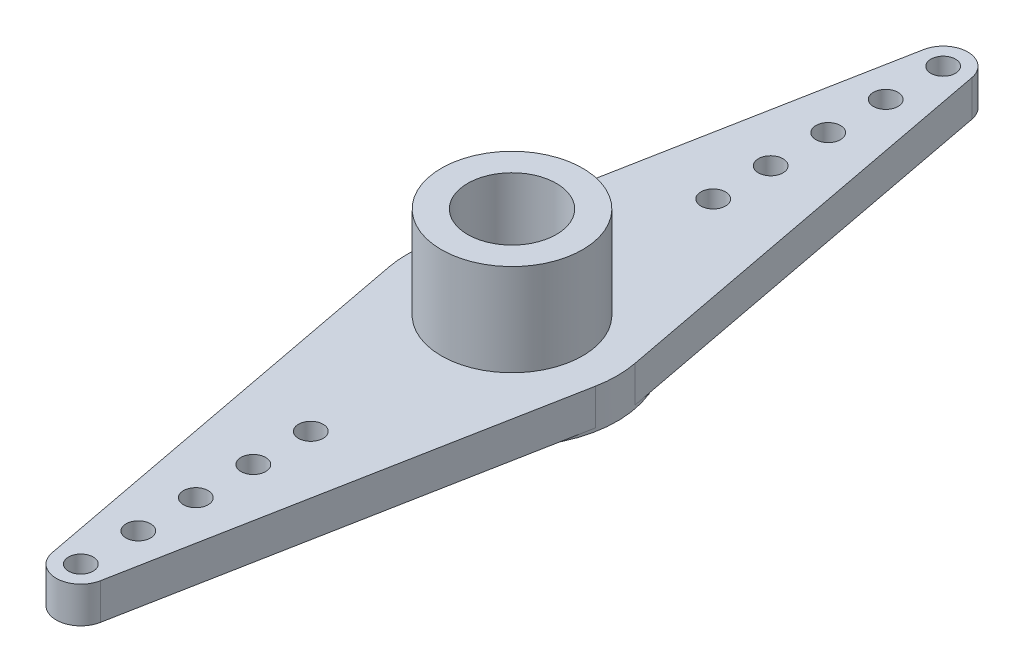
ISO-10303-21;
HEADER;
FILE_DESCRIPTION(('STEP AP214'),'2;1');
FILE_NAME('part.step','',(''),(''),'','','');
FILE_SCHEMA(('AUTOMOTIVE_DESIGN { 1 0 10303 214 1 1 1 1 }'));
ENDSEC;
DATA;
#1=APPLICATION_CONTEXT('core data for automotive mechanical design processes');
#2=APPLICATION_PROTOCOL_DEFINITION('international standard','automotive_design',2000,#1);
#3=PRODUCT_CONTEXT('',#1,'mechanical');
#4=PRODUCT('Part','Part','',(#3));
#5=PRODUCT_RELATED_PRODUCT_CATEGORY('part','',(#4));
#6=PRODUCT_DEFINITION_FORMATION('','',#4);
#7=PRODUCT_DEFINITION_CONTEXT('part definition',#1,'design');
#8=PRODUCT_DEFINITION('design','',#6,#7);
#9=PRODUCT_DEFINITION_SHAPE('','',#8);
#10=(LENGTH_UNIT() NAMED_UNIT(*) SI_UNIT(.MILLI.,.METRE.));
#11=(NAMED_UNIT(*) PLANE_ANGLE_UNIT() SI_UNIT($,.RADIAN.));
#12=(NAMED_UNIT(*) SI_UNIT($,.STERADIAN.) SOLID_ANGLE_UNIT());
#13=UNCERTAINTY_MEASURE_WITH_UNIT(LENGTH_MEASURE(1.E-05),#10,'distance_accuracy_value','');
#14=(GEOMETRIC_REPRESENTATION_CONTEXT(3) GLOBAL_UNCERTAINTY_ASSIGNED_CONTEXT((#13)) GLOBAL_UNIT_ASSIGNED_CONTEXT((#10,
#11,#12)) REPRESENTATION_CONTEXT('',''));
#15=CARTESIAN_POINT('',(0.,0.,0.));
#16=DIRECTION('',(0.,0.,1.));
#17=DIRECTION('',(1.,0.,0.));
#18=AXIS2_PLACEMENT_3D('',#15,#16,#17);
#19=CARTESIAN_POINT('',(0.,2.2,0.));
#20=DIRECTION('',(0.,-1.,0.));
#21=DIRECTION('',(0.,0.,-1.));
#22=AXIS2_PLACEMENT_3D('',#19,#20,#21);
#23=CYLINDRICAL_SURFACE('',#22,1.5);
#24=CARTESIAN_POINT('',(0.,2.2,0.));
#25=DIRECTION('',(0.,1.,0.));
#26=DIRECTION('',(0.,0.,1.));
#27=AXIS2_PLACEMENT_3D('',#24,#25,#26);
#28=CIRCLE('',#27,1.5);
#29=CARTESIAN_POINT('',(0.,2.2,1.5));
#30=VERTEX_POINT('',#29);
#31=EDGE_CURVE('E142',#30,#30,#28,.T.);
#32=ORIENTED_EDGE('',*,*,#31,.T.);
#33=EDGE_LOOP('',(#32));
#34=FACE_BOUND('',#33,.T.);
#35=CARTESIAN_POINT('',(0.,1.5,0.));
#36=DIRECTION('',(0.,-1.,0.));
#37=DIRECTION('',(0.,0.,-1.));
#38=AXIS2_PLACEMENT_3D('',#35,#36,#37);
#39=CIRCLE('',#38,1.5);
#40=CARTESIAN_POINT('',(0.,1.5,-1.5));
#41=VERTEX_POINT('',#40);
#42=EDGE_CURVE('E43',#41,#41,#39,.T.);
#43=ORIENTED_EDGE('',*,*,#42,.T.);
#44=EDGE_LOOP('',(#43));
#45=FACE_BOUND('',#44,.T.);
#46=ADVANCED_FACE('F39',(#34,#45),#23,.F.);
#47=CARTESIAN_POINT('',(0.,0.,26.25));
#48=DIRECTION('',(0.,1.,0.));
#49=DIRECTION('',(0.,0.,1.));
#50=AXIS2_PLACEMENT_3D('',#47,#48,#49);
#51=PLANE('',#50);
#52=CARTESIAN_POINT('',(0.,0.,26.25));
#53=DIRECTION('',(0.,-1.,0.));
#54=DIRECTION('',(0.,0.,-1.));
#55=AXIS2_PLACEMENT_3D('',#52,#53,#54);
#56=CIRCLE('',#55,0.75);
#57=CARTESIAN_POINT('',(0.,0.,25.5));
#58=VERTEX_POINT('',#57);
#59=EDGE_CURVE('E270',#58,#58,#56,.T.);
#60=ORIENTED_EDGE('',*,*,#59,.F.);
#61=EDGE_LOOP('',(#60));
#62=FACE_BOUND('',#61,.T.);
#63=CARTESIAN_POINT('',(0.,0.,22.75));
#64=DIRECTION('',(0.,-1.,0.));
#65=DIRECTION('',(0.,0.,-1.));
#66=AXIS2_PLACEMENT_3D('',#63,#64,#65);
#67=CIRCLE('',#66,0.75);
#68=CARTESIAN_POINT('',(0.,0.,22.));
#69=VERTEX_POINT('',#68);
#70=EDGE_CURVE('E280',#69,#69,#67,.T.);
#71=ORIENTED_EDGE('',*,*,#70,.F.);
#72=EDGE_LOOP('',(#71));
#73=FACE_BOUND('',#72,.T.);
#74=CARTESIAN_POINT('',(0.,0.,19.25));
#75=DIRECTION('',(0.,-1.,0.));
#76=DIRECTION('',(0.,0.,-1.));
#77=AXIS2_PLACEMENT_3D('',#74,#75,#76);
#78=CIRCLE('',#77,0.75);
#79=CARTESIAN_POINT('',(0.,0.,18.5));
#80=VERTEX_POINT('',#79);
#81=EDGE_CURVE('E286',#80,#80,#78,.T.);
#82=ORIENTED_EDGE('',*,*,#81,.F.);
#83=EDGE_LOOP('',(#82));
#84=FACE_BOUND('',#83,.T.);
#85=CARTESIAN_POINT('',(0.,0.,15.75));
#86=DIRECTION('',(0.,-1.,0.));
#87=DIRECTION('',(0.,0.,-1.));
#88=AXIS2_PLACEMENT_3D('',#85,#86,#87);
#89=CIRCLE('',#88,0.75);
#90=CARTESIAN_POINT('',(0.,0.,15.));
#91=VERTEX_POINT('',#90);
#92=EDGE_CURVE('E292',#91,#91,#89,.T.);
#93=ORIENTED_EDGE('',*,*,#92,.F.);
#94=EDGE_LOOP('',(#93));
#95=FACE_BOUND('',#94,.T.);
#96=CARTESIAN_POINT('',(0.,0.,12.25));
#97=DIRECTION('',(0.,-1.,0.));
#98=DIRECTION('',(0.,0.,-1.));
#99=AXIS2_PLACEMENT_3D('',#96,#97,#98);
#100=CIRCLE('',#99,0.75);
#101=CARTESIAN_POINT('',(0.,0.,11.5));
#102=VERTEX_POINT('',#101);
#103=EDGE_CURVE('E296',#102,#102,#100,.T.);
#104=ORIENTED_EDGE('',*,*,#103,.F.);
#105=EDGE_LOOP('',(#104));
#106=FACE_BOUND('',#105,.T.);
#107=CARTESIAN_POINT('',(0.,0.,0.));
#108=DIRECTION('',(0.,-1.,0.));
#109=DIRECTION('',(0.,0.,-1.));
#110=AXIS2_PLACEMENT_3D('',#107,#108,#109);
#111=CIRCLE('',#110,6.4);
#112=CARTESIAN_POINT('',(6.28750916942119,0.,1.19466666666667));
#113=VERTEX_POINT('',#112);
#114=CARTESIAN_POINT('',(-6.28750916942119,0.,1.19466666666666));
#115=VERTEX_POINT('',#114);
#116=EDGE_CURVE('E11',#113,#115,#111,.T.);
#117=ORIENTED_EDGE('',*,*,#116,.F.);
#118=DIRECTION('',(0.186666666666667,0.,-0.982423307722061));
#119=VECTOR('',#118,1.);
#120=CARTESIAN_POINT('',(1.47363496158309,0.,26.53));
#121=LINE('',#120,#119);
#122=CARTESIAN_POINT('',(1.47363496158309,0.,26.53));
#123=VERTEX_POINT('',#122);
#124=EDGE_CURVE('E141',#123,#113,#121,.T.);
#125=ORIENTED_EDGE('',*,*,#124,.F.);
#126=CARTESIAN_POINT('',(0.,0.,26.25));
#127=DIRECTION('',(0.,1.,0.));
#128=DIRECTION('',(0.,0.,1.));
#129=AXIS2_PLACEMENT_3D('',#126,#127,#128);
#130=CIRCLE('',#129,1.5);
#131=CARTESIAN_POINT('',(-1.47363496158309,0.,26.53));
#132=VERTEX_POINT('',#131);
#133=EDGE_CURVE('E138',#132,#123,#130,.T.);
#134=ORIENTED_EDGE('',*,*,#133,.F.);
#135=DIRECTION('',(0.186666666666667,0.,0.982423307722061));
#136=VECTOR('',#135,1.);
#137=CARTESIAN_POINT('',(-1.47363496158309,0.,26.53));
#138=LINE('',#137,#136);
#139=EDGE_CURVE('E87',#115,#132,#138,.T.);
#140=ORIENTED_EDGE('',*,*,#139,.F.);
#141=EDGE_LOOP('',(#117,#125,#134,#140));
#142=FACE_BOUND('',#141,.T.);
#143=ADVANCED_FACE('F205',(#62,#73,#84,#95,#106,#142),#51,.F.);
#144=CARTESIAN_POINT('',(0.,2.2,26.25));
#145=DIRECTION('',(0.,1.,0.));
#146=DIRECTION('',(0.,0.,1.));
#147=AXIS2_PLACEMENT_3D('',#144,#145,#146);
#148=PLANE('',#147);
#149=ORIENTED_EDGE('',*,*,#31,.F.);
#150=EDGE_LOOP('',(#149));
#151=FACE_BOUND('',#150,.T.);
#152=CARTESIAN_POINT('',(0.,2.2,0.));
#153=DIRECTION('',(0.,1.,0.));
#154=DIRECTION('',(0.,0.,1.));
#155=AXIS2_PLACEMENT_3D('',#152,#153,#154);
#156=CIRCLE('',#155,2.7);
#157=CARTESIAN_POINT('',(0.,2.2,2.7));
#158=VERTEX_POINT('',#157);
#159=EDGE_CURVE('E165',#158,#158,#156,.F.);
#160=ORIENTED_EDGE('',*,*,#159,.F.);
#161=EDGE_LOOP('',(#160));
#162=FACE_BOUND('',#161,.T.);
#163=ADVANCED_FACE('F229',(#151,#162),#148,.T.);
#164=CARTESIAN_POINT('',(0.,2.2,-12.25));
#165=DIRECTION('',(0.,1.,0.));
#166=DIRECTION('',(0.,0.,1.));
#167=AXIS2_PLACEMENT_3D('',#164,#165,#166);
#168=CIRCLE('',#167,0.75);
#169=CARTESIAN_POINT('',(0.,2.2,-11.5));
#170=VERTEX_POINT('',#169);
#171=EDGE_CURVE('E277',#170,#170,#168,.T.);
#172=ORIENTED_EDGE('',*,*,#171,.F.);
#173=EDGE_LOOP('',(#172));
#174=FACE_BOUND('',#173,.T.);
#175=CARTESIAN_POINT('',(0.,2.2,-15.75));
#176=DIRECTION('',(0.,1.,0.));
#177=DIRECTION('',(0.,0.,1.));
#178=AXIS2_PLACEMENT_3D('',#175,#176,#177);
#179=CIRCLE('',#178,0.75);
#180=CARTESIAN_POINT('',(0.,2.2,-15.));
#181=VERTEX_POINT('',#180);
#182=EDGE_CURVE('E522',#181,#181,#179,.T.);
#183=ORIENTED_EDGE('',*,*,#182,.F.);
#184=EDGE_LOOP('',(#183));
#185=FACE_BOUND('',#184,.T.);
#186=CARTESIAN_POINT('',(0.,2.2,-19.25));
#187=DIRECTION('',(0.,1.,0.));
#188=DIRECTION('',(0.,0.,1.));
#189=AXIS2_PLACEMENT_3D('',#186,#187,#188);
#190=CIRCLE('',#189,0.75);
#191=CARTESIAN_POINT('',(0.,2.2,-18.5));
#192=VERTEX_POINT('',#191);
#193=EDGE_CURVE('E528',#192,#192,#190,.T.);
#194=ORIENTED_EDGE('',*,*,#193,.F.);
#195=EDGE_LOOP('',(#194));
#196=FACE_BOUND('',#195,.T.);
#197=CARTESIAN_POINT('',(0.,2.2,-22.75));
#198=DIRECTION('',(0.,1.,0.));
#199=DIRECTION('',(0.,0.,1.));
#200=AXIS2_PLACEMENT_3D('',#197,#198,#199);
#201=CIRCLE('',#200,0.75);
#202=CARTESIAN_POINT('',(0.,2.2,-22.));
#203=VERTEX_POINT('',#202);
#204=EDGE_CURVE('E267',#203,#203,#201,.T.);
#205=ORIENTED_EDGE('',*,*,#204,.F.);
#206=EDGE_LOOP('',(#205));
#207=FACE_BOUND('',#206,.T.);
#208=CARTESIAN_POINT('',(0.,2.2,-26.25));
#209=DIRECTION('',(0.,1.,0.));
#210=DIRECTION('',(0.,0.,1.));
#211=AXIS2_PLACEMENT_3D('',#208,#209,#210);
#212=CIRCLE('',#211,0.75);
#213=CARTESIAN_POINT('',(0.,2.2,-25.5));
#214=VERTEX_POINT('',#213);
#215=EDGE_CURVE('E262',#214,#214,#212,.T.);
#216=ORIENTED_EDGE('',*,*,#215,.F.);
#217=EDGE_LOOP('',(#216));
#218=FACE_BOUND('',#217,.T.);
#219=CARTESIAN_POINT('',(0.,2.2,26.25));
#220=DIRECTION('',(0.,1.,0.));
#221=DIRECTION('',(0.,0.,1.));
#222=AXIS2_PLACEMENT_3D('',#219,#220,#221);
#223=CIRCLE('',#222,0.75);
#224=CARTESIAN_POINT('',(0.,2.2,27.));
#225=VERTEX_POINT('',#224);
#226=EDGE_CURVE('E274',#225,#225,#223,.F.);
#227=ORIENTED_EDGE('',*,*,#226,.T.);
#228=EDGE_LOOP('',(#227));
#229=FACE_BOUND('',#228,.T.);
#230=CARTESIAN_POINT('',(0.,2.2,22.75));
#231=DIRECTION('',(0.,1.,0.));
#232=DIRECTION('',(0.,0.,1.));
#233=AXIS2_PLACEMENT_3D('',#230,#231,#232);
#234=CIRCLE('',#233,0.75);
#235=CARTESIAN_POINT('',(0.,2.2,23.5));
#236=VERTEX_POINT('',#235);
#237=EDGE_CURVE('E273',#236,#236,#234,.F.);
#238=ORIENTED_EDGE('',*,*,#237,.T.);
#239=EDGE_LOOP('',(#238));
#240=FACE_BOUND('',#239,.T.);
#241=CARTESIAN_POINT('',(0.,2.2,19.25));
#242=DIRECTION('',(0.,1.,0.));
#243=DIRECTION('',(0.,0.,1.));
#244=AXIS2_PLACEMENT_3D('',#241,#242,#243);
#245=CIRCLE('',#244,0.75);
#246=CARTESIAN_POINT('',(0.,2.2,20.));
#247=VERTEX_POINT('',#246);
#248=EDGE_CURVE('E283',#247,#247,#245,.F.);
#249=ORIENTED_EDGE('',*,*,#248,.T.);
#250=EDGE_LOOP('',(#249));
#251=FACE_BOUND('',#250,.T.);
#252=CARTESIAN_POINT('',(0.,2.2,15.75));
#253=DIRECTION('',(0.,1.,0.));
#254=DIRECTION('',(0.,0.,1.));
#255=AXIS2_PLACEMENT_3D('',#252,#253,#254);
#256=CIRCLE('',#255,0.75);
#257=CARTESIAN_POINT('',(0.,2.2,16.5));
#258=VERTEX_POINT('',#257);
#259=EDGE_CURVE('E289',#258,#258,#256,.F.);
#260=ORIENTED_EDGE('',*,*,#259,.T.);
#261=EDGE_LOOP('',(#260));
#262=FACE_BOUND('',#261,.T.);
#263=CARTESIAN_POINT('',(0.,2.2,12.25));
#264=DIRECTION('',(0.,1.,0.));
#265=DIRECTION('',(0.,0.,1.));
#266=AXIS2_PLACEMENT_3D('',#263,#264,#265);
#267=CIRCLE('',#266,0.75);
#268=CARTESIAN_POINT('',(0.,2.2,13.));
#269=VERTEX_POINT('',#268);
#270=EDGE_CURVE('E295',#269,#269,#267,.F.);
#271=ORIENTED_EDGE('',*,*,#270,.T.);
#272=EDGE_LOOP('',(#271));
#273=FACE_BOUND('',#272,.T.);
#274=CARTESIAN_POINT('',(0.,2.2,0.));
#275=DIRECTION('',(0.,1.,0.));
#276=DIRECTION('',(0.,0.,1.));
#277=AXIS2_PLACEMENT_3D('',#274,#275,#276);
#278=CIRCLE('',#277,4.3);
#279=CARTESIAN_POINT('',(0.,2.2,4.3));
#280=VERTEX_POINT('',#279);
#281=EDGE_CURVE('E177',#280,#280,#278,.T.);
#282=ORIENTED_EDGE('',*,*,#281,.F.);
#283=EDGE_LOOP('',(#282));
#284=FACE_BOUND('',#283,.T.);
#285=CARTESIAN_POINT('',(0.,2.2,26.25));
#286=DIRECTION('',(0.,1.,0.));
#287=DIRECTION('',(0.,0.,1.));
#288=AXIS2_PLACEMENT_3D('',#285,#286,#287);
#289=CIRCLE('',#288,1.5);
#290=CARTESIAN_POINT('',(-1.47363496158309,2.2,26.53));
#291=VERTEX_POINT('',#290);
#292=CARTESIAN_POINT('',(1.47363496158309,2.2,26.53));
#293=VERTEX_POINT('',#292);
#294=EDGE_CURVE('E151',#291,#293,#289,.T.);
#295=ORIENTED_EDGE('',*,*,#294,.T.);
#296=DIRECTION('',(0.186666666666667,0.,-0.982423307722061));
#297=VECTOR('',#296,1.);
#298=CARTESIAN_POINT('',(1.47363496158309,2.2,26.53));
#299=LINE('',#298,#297);
#300=CARTESIAN_POINT('',(6.28750916942119,2.2,1.19466666666667));
#301=VERTEX_POINT('',#300);
#302=EDGE_CURVE('E96',#293,#301,#299,.T.);
#303=ORIENTED_EDGE('',*,*,#302,.T.);
#304=CARTESIAN_POINT('',(0.,2.2,0.));
#305=DIRECTION('',(0.,1.,0.));
#306=DIRECTION('',(0.,0.,1.));
#307=AXIS2_PLACEMENT_3D('',#304,#305,#306);
#308=CIRCLE('',#307,6.4);
#309=CARTESIAN_POINT('',(6.28750916942119,2.2,-1.19466666666667));
#310=VERTEX_POINT('',#309);
#311=EDGE_CURVE('E187',#301,#310,#308,.T.);
#312=ORIENTED_EDGE('',*,*,#311,.T.);
#313=DIRECTION('',(-0.186666666666667,0.,-0.982423307722061));
#314=VECTOR('',#313,1.);
#315=CARTESIAN_POINT('',(1.47363496158309,2.2,-26.53));
#316=LINE('',#315,#314);
#317=CARTESIAN_POINT('',(1.47363496158309,2.2,-26.53));
#318=VERTEX_POINT('',#317);
#319=EDGE_CURVE('E189',#310,#318,#316,.T.);
#320=ORIENTED_EDGE('',*,*,#319,.T.);
#321=CARTESIAN_POINT('',(0.,2.2,-26.25));
#322=DIRECTION('',(0.,1.,0.));
#323=DIRECTION('',(0.,0.,1.));
#324=AXIS2_PLACEMENT_3D('',#321,#322,#323);
#325=CIRCLE('',#324,1.5);
#326=CARTESIAN_POINT('',(-1.47363496158309,2.2,-26.53));
#327=VERTEX_POINT('',#326);
#328=EDGE_CURVE('E116',#318,#327,#325,.T.);
#329=ORIENTED_EDGE('',*,*,#328,.T.);
#330=DIRECTION('',(-0.186666666666667,0.,0.982423307722061));
#331=VECTOR('',#330,1.);
#332=CARTESIAN_POINT('',(-1.47363496158309,2.2,-26.53));
#333=LINE('',#332,#331);
#334=CARTESIAN_POINT('',(-6.28750916942119,2.2,-1.19466666666667));
#335=VERTEX_POINT('',#334);
#336=EDGE_CURVE('E110',#327,#335,#333,.T.);
#337=ORIENTED_EDGE('',*,*,#336,.T.);
#338=CARTESIAN_POINT('',(0.,2.2,0.));
#339=DIRECTION('',(0.,1.,0.));
#340=DIRECTION('',(0.,0.,1.));
#341=AXIS2_PLACEMENT_3D('',#338,#339,#340);
#342=CIRCLE('',#341,6.4);
#343=CARTESIAN_POINT('',(-6.28750916942119,2.2,1.19466666666666));
#344=VERTEX_POINT('',#343);
#345=EDGE_CURVE('E114',#335,#344,#342,.T.);
#346=ORIENTED_EDGE('',*,*,#345,.T.);
#347=DIRECTION('',(0.186666666666667,0.,0.982423307722061));
#348=VECTOR('',#347,1.);
#349=CARTESIAN_POINT('',(-1.47363496158309,2.2,26.53));
#350=LINE('',#349,#348);
#351=EDGE_CURVE('E58',#344,#291,#350,.T.);
#352=ORIENTED_EDGE('',*,*,#351,.T.);
#353=EDGE_LOOP('',(#295,#303,#312,#320,#329,#337,#346,#352));
#354=FACE_BOUND('',#353,.T.);
#355=ADVANCED_FACE('F112',(#174,#185,#196,#207,#218,#229,#240,#251,#262,#273,#284,#354),#148,.T.);
#356=CARTESIAN_POINT('',(0.,0.,-12.25));
#357=DIRECTION('',(0.,1.,0.));
#358=DIRECTION('',(0.,0.,1.));
#359=AXIS2_PLACEMENT_3D('',#356,#357,#358);
#360=CIRCLE('',#359,0.75);
#361=CARTESIAN_POINT('',(0.,0.,-11.5));
#362=VERTEX_POINT('',#361);
#363=EDGE_CURVE('E245',#362,#362,#360,.T.);
#364=ORIENTED_EDGE('',*,*,#363,.T.);
#365=EDGE_LOOP('',(#364));
#366=FACE_BOUND('',#365,.T.);
#367=CARTESIAN_POINT('',(0.,0.,-15.75));
#368=DIRECTION('',(0.,1.,0.));
#369=DIRECTION('',(0.,0.,1.));
#370=AXIS2_PLACEMENT_3D('',#367,#368,#369);
#371=CIRCLE('',#370,0.75);
#372=CARTESIAN_POINT('',(0.,0.,-15.));
#373=VERTEX_POINT('',#372);
#374=EDGE_CURVE('E249',#373,#373,#371,.T.);
#375=ORIENTED_EDGE('',*,*,#374,.T.);
#376=EDGE_LOOP('',(#375));
#377=FACE_BOUND('',#376,.T.);
#378=CARTESIAN_POINT('',(0.,0.,-19.25));
#379=DIRECTION('',(0.,1.,0.));
#380=DIRECTION('',(0.,0.,1.));
#381=AXIS2_PLACEMENT_3D('',#378,#379,#380);
#382=CIRCLE('',#381,0.75);
#383=CARTESIAN_POINT('',(0.,0.,-18.5));
#384=VERTEX_POINT('',#383);
#385=EDGE_CURVE('E253',#384,#384,#382,.T.);
#386=ORIENTED_EDGE('',*,*,#385,.T.);
#387=EDGE_LOOP('',(#386));
#388=FACE_BOUND('',#387,.T.);
#389=CARTESIAN_POINT('',(0.,0.,-22.75));
#390=DIRECTION('',(0.,1.,0.));
#391=DIRECTION('',(0.,0.,1.));
#392=AXIS2_PLACEMENT_3D('',#389,#390,#391);
#393=CIRCLE('',#392,0.75);
#394=CARTESIAN_POINT('',(0.,0.,-22.));
#395=VERTEX_POINT('',#394);
#396=EDGE_CURVE('E257',#395,#395,#393,.T.);
#397=ORIENTED_EDGE('',*,*,#396,.T.);
#398=EDGE_LOOP('',(#397));
#399=FACE_BOUND('',#398,.T.);
#400=CARTESIAN_POINT('',(0.,0.,-26.25));
#401=DIRECTION('',(0.,1.,0.));
#402=DIRECTION('',(0.,0.,1.));
#403=AXIS2_PLACEMENT_3D('',#400,#401,#402);
#404=CIRCLE('',#403,0.75);
#405=CARTESIAN_POINT('',(0.,0.,-25.5));
#406=VERTEX_POINT('',#405);
#407=EDGE_CURVE('E260',#406,#406,#404,.T.);
#408=ORIENTED_EDGE('',*,*,#407,.T.);
#409=EDGE_LOOP('',(#408));
#410=FACE_BOUND('',#409,.T.);
#411=CARTESIAN_POINT('',(-6.28750916942119,0.,-1.19466666666667));
#412=VERTEX_POINT('',#411);
#413=CARTESIAN_POINT('',(6.28750916942119,0.,-1.19466666666667));
#414=VERTEX_POINT('',#413);
#415=EDGE_CURVE('E49',#412,#414,#111,.T.);
#416=ORIENTED_EDGE('',*,*,#415,.F.);
#417=DIRECTION('',(-0.186666666666667,0.,0.982423307722061));
#418=VECTOR('',#417,1.);
#419=CARTESIAN_POINT('',(-1.47363496158309,0.,-26.53));
#420=LINE('',#419,#418);
#421=CARTESIAN_POINT('',(-1.47363496158309,0.,-26.53));
#422=VERTEX_POINT('',#421);
#423=EDGE_CURVE('E126',#422,#412,#420,.T.);
#424=ORIENTED_EDGE('',*,*,#423,.F.);
#425=CARTESIAN_POINT('',(0.,0.,-26.25));
#426=DIRECTION('',(0.,1.,0.));
#427=DIRECTION('',(0.,0.,1.));
#428=AXIS2_PLACEMENT_3D('',#425,#426,#427);
#429=CIRCLE('',#428,1.5);
#430=CARTESIAN_POINT('',(1.47363496158309,0.,-26.53));
#431=VERTEX_POINT('',#430);
#432=EDGE_CURVE('E147',#431,#422,#429,.T.);
#433=ORIENTED_EDGE('',*,*,#432,.F.);
#434=DIRECTION('',(-0.186666666666667,0.,-0.982423307722061));
#435=VECTOR('',#434,1.);
#436=CARTESIAN_POINT('',(1.47363496158309,0.,-26.53));
#437=LINE('',#436,#435);
#438=EDGE_CURVE('E145',#414,#431,#437,.T.);
#439=ORIENTED_EDGE('',*,*,#438,.F.);
#440=EDGE_LOOP('',(#416,#424,#433,#439));
#441=FACE_BOUND('',#440,.T.);
#442=ADVANCED_FACE('F200',(#366,#377,#388,#399,#410,#441),#51,.F.);
#443=CARTESIAN_POINT('',(0.,2.2,26.25));
#444=DIRECTION('',(0.,-1.,0.));
#445=DIRECTION('',(0.,0.,-1.));
#446=AXIS2_PLACEMENT_3D('',#443,#444,#445);
#447=CYLINDRICAL_SURFACE('',#446,1.5);
#448=ORIENTED_EDGE('',*,*,#133,.T.);
#449=DIRECTION('',(0.,-1.,0.));
#450=VECTOR('',#449,1.);
#451=CARTESIAN_POINT('',(1.47363496158309,2.2,26.53));
#452=LINE('',#451,#450);
#453=EDGE_CURVE('E164',#293,#123,#452,.T.);
#454=ORIENTED_EDGE('',*,*,#453,.F.);
#455=ORIENTED_EDGE('',*,*,#294,.F.);
#456=DIRECTION('',(0.,-1.,0.));
#457=VECTOR('',#456,1.);
#458=CARTESIAN_POINT('',(-1.47363496158309,2.2,26.53));
#459=LINE('',#458,#457);
#460=EDGE_CURVE('E134',#291,#132,#459,.T.);
#461=ORIENTED_EDGE('',*,*,#460,.T.);
#462=EDGE_LOOP('',(#448,#454,#455,#461));
#463=FACE_BOUND('',#462,.T.);
#464=ADVANCED_FACE('F41',(#463),#447,.T.);
#465=CARTESIAN_POINT('',(1.47363496158309,2.2,26.53));
#466=DIRECTION('',(-0.982423307722061,0.,-0.186666666666667));
#467=DIRECTION('',(-0.186666666666667,0.,0.982423307722061));
#468=AXIS2_PLACEMENT_3D('',#465,#466,#467);
#469=PLANE('',#468);
#470=ORIENTED_EDGE('',*,*,#124,.T.);
#471=DIRECTION('',(0.,-1.,0.));
#472=VECTOR('',#471,1.);
#473=CARTESIAN_POINT('',(6.28750916942119,2.2,1.19466666666667));
#474=LINE('',#473,#472);
#475=EDGE_CURVE('E161',#301,#113,#474,.T.);
#476=ORIENTED_EDGE('',*,*,#475,.F.);
#477=ORIENTED_EDGE('',*,*,#302,.F.);
#478=ORIENTED_EDGE('',*,*,#453,.T.);
#479=EDGE_LOOP('',(#470,#476,#477,#478));
#480=FACE_BOUND('',#479,.T.);
#481=ADVANCED_FACE('F201',(#480),#469,.F.);
#482=CARTESIAN_POINT('',(1.47363496158309,2.2,-26.53));
#483=DIRECTION('',(-0.982423307722061,0.,0.186666666666667));
#484=DIRECTION('',(0.186666666666667,0.,0.982423307722061));
#485=AXIS2_PLACEMENT_3D('',#482,#483,#484);
#486=PLANE('',#485);
#487=ORIENTED_EDGE('',*,*,#438,.T.);
#488=DIRECTION('',(0.,-1.,0.));
#489=VECTOR('',#488,1.);
#490=CARTESIAN_POINT('',(1.47363496158309,2.2,-26.53));
#491=LINE('',#490,#489);
#492=EDGE_CURVE('E155',#318,#431,#491,.T.);
#493=ORIENTED_EDGE('',*,*,#492,.F.);
#494=ORIENTED_EDGE('',*,*,#319,.F.);
#495=DIRECTION('',(0.,-1.,0.));
#496=VECTOR('',#495,1.);
#497=CARTESIAN_POINT('',(6.28750916942119,2.2,-1.19466666666667));
#498=LINE('',#497,#496);
#499=EDGE_CURVE('E158',#310,#414,#498,.T.);
#500=ORIENTED_EDGE('',*,*,#499,.T.);
#501=EDGE_LOOP('',(#487,#493,#494,#500));
#502=FACE_BOUND('',#501,.T.);
#503=ADVANCED_FACE('F194',(#502),#486,.F.);
#504=CARTESIAN_POINT('',(0.,2.2,-26.25));
#505=DIRECTION('',(0.,-1.,0.));
#506=DIRECTION('',(0.,0.,-1.));
#507=AXIS2_PLACEMENT_3D('',#504,#505,#506);
#508=CYLINDRICAL_SURFACE('',#507,1.5);
#509=ORIENTED_EDGE('',*,*,#432,.T.);
#510=DIRECTION('',(0.,-1.,0.));
#511=VECTOR('',#510,1.);
#512=CARTESIAN_POINT('',(-1.47363496158309,2.2,-26.53));
#513=LINE('',#512,#511);
#514=EDGE_CURVE('E129',#327,#422,#513,.T.);
#515=ORIENTED_EDGE('',*,*,#514,.F.);
#516=ORIENTED_EDGE('',*,*,#328,.F.);
#517=ORIENTED_EDGE('',*,*,#492,.T.);
#518=EDGE_LOOP('',(#509,#515,#516,#517));
#519=FACE_BOUND('',#518,.T.);
#520=ADVANCED_FACE('F198',(#519),#508,.T.);
#521=CARTESIAN_POINT('',(-1.47363496158309,2.2,-26.53));
#522=DIRECTION('',(0.982423307722061,0.,0.186666666666667));
#523=DIRECTION('',(0.186666666666667,0.,-0.982423307722061));
#524=AXIS2_PLACEMENT_3D('',#521,#522,#523);
#525=PLANE('',#524);
#526=ORIENTED_EDGE('',*,*,#423,.T.);
#527=DIRECTION('',(0.,-1.,0.));
#528=VECTOR('',#527,1.);
#529=CARTESIAN_POINT('',(-6.28750916942119,2.2,-1.19466666666667));
#530=LINE('',#529,#528);
#531=EDGE_CURVE('E123',#335,#412,#530,.T.);
#532=ORIENTED_EDGE('',*,*,#531,.F.);
#533=ORIENTED_EDGE('',*,*,#336,.F.);
#534=ORIENTED_EDGE('',*,*,#514,.T.);
#535=EDGE_LOOP('',(#526,#532,#533,#534));
#536=FACE_BOUND('',#535,.T.);
#537=ADVANCED_FACE('F124',(#536),#525,.F.);
#538=CARTESIAN_POINT('',(0.,2.2,0.));
#539=DIRECTION('',(0.,-1.,0.));
#540=DIRECTION('',(0.,0.,-1.));
#541=AXIS2_PLACEMENT_3D('',#538,#539,#540);
#542=CYLINDRICAL_SURFACE('',#541,6.4);
#543=ORIENTED_EDGE('',*,*,#531,.T.);
#544=ORIENTED_EDGE('',*,*,#415,.T.);
#545=ORIENTED_EDGE('',*,*,#499,.F.);
#546=ORIENTED_EDGE('',*,*,#311,.F.);
#547=ORIENTED_EDGE('',*,*,#475,.T.);
#548=ORIENTED_EDGE('',*,*,#116,.T.);
#549=DIRECTION('',(0.,-1.,0.));
#550=VECTOR('',#549,1.);
#551=CARTESIAN_POINT('',(-6.28750916942119,2.2,1.19466666666666));
#552=LINE('',#551,#550);
#553=EDGE_CURVE('E84',#344,#115,#552,.T.);
#554=ORIENTED_EDGE('',*,*,#553,.F.);
#555=ORIENTED_EDGE('',*,*,#345,.F.);
#556=EDGE_LOOP('',(#543,#544,#545,#546,#547,#548,#554,#555));
#557=FACE_BOUND('',#556,.T.);
#558=CARTESIAN_POINT('',(0.,-0.2,0.));
#559=DIRECTION('',(0.,-1.,0.));
#560=DIRECTION('',(0.,0.,-1.));
#561=AXIS2_PLACEMENT_3D('',#558,#559,#560);
#562=CIRCLE('',#561,6.4);
#563=CARTESIAN_POINT('',(0.,-0.2,-6.4));
#564=VERTEX_POINT('',#563);
#565=EDGE_CURVE('E172',#564,#564,#562,.T.);
#566=ORIENTED_EDGE('',*,*,#565,.F.);
#567=EDGE_LOOP('',(#566));
#568=FACE_BOUND('',#567,.T.);
#569=ADVANCED_FACE('F131',(#557,#568),#542,.T.);
#570=CARTESIAN_POINT('',(-1.47363496158309,2.2,26.53));
#571=DIRECTION('',(0.982423307722061,0.,-0.186666666666667));
#572=DIRECTION('',(-0.186666666666667,0.,-0.982423307722061));
#573=AXIS2_PLACEMENT_3D('',#570,#571,#572);
#574=PLANE('',#573);
#575=ORIENTED_EDGE('',*,*,#139,.T.);
#576=ORIENTED_EDGE('',*,*,#460,.F.);
#577=ORIENTED_EDGE('',*,*,#351,.F.);
#578=ORIENTED_EDGE('',*,*,#553,.T.);
#579=EDGE_LOOP('',(#575,#576,#577,#578));
#580=FACE_BOUND('',#579,.T.);
#581=ADVANCED_FACE('F208',(#580),#574,.F.);
#582=CARTESIAN_POINT('',(0.,7.8,0.));
#583=DIRECTION('',(0.,1.,0.));
#584=DIRECTION('',(0.,0.,1.));
#585=AXIS2_PLACEMENT_3D('',#582,#583,#584);
#586=PLANE('',#585);
#587=CARTESIAN_POINT('',(0.,7.8,0.));
#588=DIRECTION('',(0.,1.,0.));
#589=DIRECTION('',(0.,0.,1.));
#590=AXIS2_PLACEMENT_3D('',#587,#588,#589);
#591=CIRCLE('',#590,4.3);
#592=CARTESIAN_POINT('',(0.,7.8,4.3));
#593=VERTEX_POINT('',#592);
#594=EDGE_CURVE('E178',#593,#593,#591,.T.);
#595=ORIENTED_EDGE('',*,*,#594,.T.);
#596=EDGE_LOOP('',(#595));
#597=FACE_BOUND('',#596,.T.);
#598=CARTESIAN_POINT('',(0.,7.8,0.));
#599=DIRECTION('',(0.,1.,0.));
#600=DIRECTION('',(0.,0.,1.));
#601=AXIS2_PLACEMENT_3D('',#598,#599,#600);
#602=CIRCLE('',#601,2.7);
#603=CARTESIAN_POINT('',(0.,7.8,2.7));
#604=VERTEX_POINT('',#603);
#605=EDGE_CURVE('E174',#604,#604,#602,.T.);
#606=ORIENTED_EDGE('',*,*,#605,.F.);
#607=EDGE_LOOP('',(#606));
#608=FACE_BOUND('',#607,.T.);
#609=ADVANCED_FACE('F210',(#597,#608),#586,.T.);
#610=CARTESIAN_POINT('',(0.,7.8,0.));
#611=DIRECTION('',(0.,-1.,0.));
#612=DIRECTION('',(0.,0.,-1.));
#613=AXIS2_PLACEMENT_3D('',#610,#611,#612);
#614=CYLINDRICAL_SURFACE('',#613,4.3);
#615=ORIENTED_EDGE('',*,*,#594,.F.);
#616=EDGE_LOOP('',(#615));
#617=FACE_BOUND('',#616,.T.);
#618=ORIENTED_EDGE('',*,*,#281,.T.);
#619=EDGE_LOOP('',(#618));
#620=FACE_BOUND('',#619,.T.);
#621=ADVANCED_FACE('F217',(#617,#620),#614,.T.);
#622=CARTESIAN_POINT('',(0.,7.8,0.));
#623=DIRECTION('',(0.,-1.,0.));
#624=DIRECTION('',(0.,0.,-1.));
#625=AXIS2_PLACEMENT_3D('',#622,#623,#624);
#626=CYLINDRICAL_SURFACE('',#625,2.7);
#627=ORIENTED_EDGE('',*,*,#605,.T.);
#628=EDGE_LOOP('',(#627));
#629=FACE_BOUND('',#628,.T.);
#630=ORIENTED_EDGE('',*,*,#159,.T.);
#631=EDGE_LOOP('',(#630));
#632=FACE_BOUND('',#631,.T.);
#633=ADVANCED_FACE('F323',(#629,#632),#626,.F.);
#634=CARTESIAN_POINT('',(0.,-0.2,0.));
#635=DIRECTION('',(0.,-1.,0.));
#636=DIRECTION('',(0.,0.,-1.));
#637=AXIS2_PLACEMENT_3D('',#634,#635,#636);
#638=PLANE('',#637);
#639=ORIENTED_EDGE('',*,*,#565,.T.);
#640=EDGE_LOOP('',(#639));
#641=FACE_BOUND('',#640,.T.);
#642=CARTESIAN_POINT('',(0.,-0.2,0.));
#643=DIRECTION('',(0.,-1.,0.));
#644=DIRECTION('',(0.,0.,-1.));
#645=AXIS2_PLACEMENT_3D('',#642,#643,#644);
#646=CIRCLE('',#645,2.7);
#647=CARTESIAN_POINT('',(0.,-0.2,-2.7));
#648=VERTEX_POINT('',#647);
#649=EDGE_CURVE('E303',#648,#648,#646,.T.);
#650=ORIENTED_EDGE('',*,*,#649,.F.);
#651=EDGE_LOOP('',(#650));
#652=FACE_BOUND('',#651,.T.);
#653=ADVANCED_FACE('F319',(#641,#652),#638,.T.);
#654=CARTESIAN_POINT('',(0.,-0.2,0.));
#655=DIRECTION('',(0.,1.,0.));
#656=DIRECTION('',(0.,0.,1.));
#657=AXIS2_PLACEMENT_3D('',#654,#655,#656);
#658=CYLINDRICAL_SURFACE('',#657,2.7);
#659=ORIENTED_EDGE('',*,*,#649,.T.);
#660=EDGE_LOOP('',(#659));
#661=FACE_BOUND('',#660,.T.);
#662=CARTESIAN_POINT('',(0.,1.5,0.));
#663=DIRECTION('',(0.,-1.,0.));
#664=DIRECTION('',(0.,0.,-1.));
#665=AXIS2_PLACEMENT_3D('',#662,#663,#664);
#666=CIRCLE('',#665,2.7);
#667=CARTESIAN_POINT('',(0.,1.5,-2.7));
#668=VERTEX_POINT('',#667);
#669=EDGE_CURVE('E299',#668,#668,#666,.T.);
#670=ORIENTED_EDGE('',*,*,#669,.F.);
#671=EDGE_LOOP('',(#670));
#672=FACE_BOUND('',#671,.T.);
#673=ADVANCED_FACE('F315',(#661,#672),#658,.F.);
#674=CARTESIAN_POINT('',(0.,1.5,0.));
#675=DIRECTION('',(0.,-1.,0.));
#676=DIRECTION('',(0.,0.,-1.));
#677=AXIS2_PLACEMENT_3D('',#674,#675,#676);
#678=PLANE('',#677);
#679=ORIENTED_EDGE('',*,*,#42,.F.);
#680=EDGE_LOOP('',(#679));
#681=FACE_BOUND('',#680,.T.);
#682=ORIENTED_EDGE('',*,*,#669,.T.);
#683=EDGE_LOOP('',(#682));
#684=FACE_BOUND('',#683,.T.);
#685=ADVANCED_FACE('F311',(#681,#684),#678,.T.);
#686=CARTESIAN_POINT('',(0.,7.801,12.25));
#687=DIRECTION('',(0.,-1.,0.));
#688=DIRECTION('',(0.,0.,-1.));
#689=AXIS2_PLACEMENT_3D('',#686,#687,#688);
#690=CYLINDRICAL_SURFACE('',#689,0.75);
#691=ORIENTED_EDGE('',*,*,#270,.F.);
#692=EDGE_LOOP('',(#691));
#693=FACE_BOUND('',#692,.T.);
#694=ORIENTED_EDGE('',*,*,#103,.T.);
#695=EDGE_LOOP('',(#694));
#696=FACE_BOUND('',#695,.T.);
#697=ADVANCED_FACE('F314',(#693,#696),#690,.F.);
#698=CARTESIAN_POINT('',(0.,7.801,15.75));
#699=DIRECTION('',(0.,-1.,0.));
#700=DIRECTION('',(0.,0.,-1.));
#701=AXIS2_PLACEMENT_3D('',#698,#699,#700);
#702=CYLINDRICAL_SURFACE('',#701,0.75);
#703=ORIENTED_EDGE('',*,*,#259,.F.);
#704=EDGE_LOOP('',(#703));
#705=FACE_BOUND('',#704,.T.);
#706=ORIENTED_EDGE('',*,*,#92,.T.);
#707=EDGE_LOOP('',(#706));
#708=FACE_BOUND('',#707,.T.);
#709=ADVANCED_FACE('F432',(#705,#708),#702,.F.);
#710=CARTESIAN_POINT('',(0.,7.801,19.25));
#711=DIRECTION('',(0.,-1.,0.));
#712=DIRECTION('',(0.,0.,-1.));
#713=AXIS2_PLACEMENT_3D('',#710,#711,#712);
#714=CYLINDRICAL_SURFACE('',#713,0.75);
#715=ORIENTED_EDGE('',*,*,#248,.F.);
#716=EDGE_LOOP('',(#715));
#717=FACE_BOUND('',#716,.T.);
#718=ORIENTED_EDGE('',*,*,#81,.T.);
#719=EDGE_LOOP('',(#718));
#720=FACE_BOUND('',#719,.T.);
#721=ADVANCED_FACE('F440',(#717,#720),#714,.F.);
#722=CARTESIAN_POINT('',(0.,7.801,22.75));
#723=DIRECTION('',(0.,-1.,0.));
#724=DIRECTION('',(0.,0.,-1.));
#725=AXIS2_PLACEMENT_3D('',#722,#723,#724);
#726=CYLINDRICAL_SURFACE('',#725,0.75);
#727=ORIENTED_EDGE('',*,*,#237,.F.);
#728=EDGE_LOOP('',(#727));
#729=FACE_BOUND('',#728,.T.);
#730=ORIENTED_EDGE('',*,*,#70,.T.);
#731=EDGE_LOOP('',(#730));
#732=FACE_BOUND('',#731,.T.);
#733=ADVANCED_FACE('F449',(#729,#732),#726,.F.);
#734=CARTESIAN_POINT('',(0.,7.801,26.25));
#735=DIRECTION('',(0.,-1.,0.));
#736=DIRECTION('',(0.,0.,-1.));
#737=AXIS2_PLACEMENT_3D('',#734,#735,#736);
#738=CYLINDRICAL_SURFACE('',#737,0.75);
#739=ORIENTED_EDGE('',*,*,#226,.F.);
#740=EDGE_LOOP('',(#739));
#741=FACE_BOUND('',#740,.T.);
#742=ORIENTED_EDGE('',*,*,#59,.T.);
#743=EDGE_LOOP('',(#742));
#744=FACE_BOUND('',#743,.T.);
#745=ADVANCED_FACE('F458',(#741,#744),#738,.F.);
#746=CARTESIAN_POINT('',(0.,7.801,-26.25));
#747=DIRECTION('',(0.,-1.,0.));
#748=DIRECTION('',(0.,0.,-1.));
#749=AXIS2_PLACEMENT_3D('',#746,#747,#748);
#750=CYLINDRICAL_SURFACE('',#749,0.75);
#751=ORIENTED_EDGE('',*,*,#215,.T.);
#752=EDGE_LOOP('',(#751));
#753=FACE_BOUND('',#752,.T.);
#754=ORIENTED_EDGE('',*,*,#407,.F.);
#755=EDGE_LOOP('',(#754));
#756=FACE_BOUND('',#755,.T.);
#757=ADVANCED_FACE('F467',(#753,#756),#750,.F.);
#758=CARTESIAN_POINT('',(0.,7.801,-22.75));
#759=DIRECTION('',(0.,-1.,0.));
#760=DIRECTION('',(0.,0.,-1.));
#761=AXIS2_PLACEMENT_3D('',#758,#759,#760);
#762=CYLINDRICAL_SURFACE('',#761,0.75);
#763=ORIENTED_EDGE('',*,*,#204,.T.);
#764=EDGE_LOOP('',(#763));
#765=FACE_BOUND('',#764,.T.);
#766=ORIENTED_EDGE('',*,*,#396,.F.);
#767=EDGE_LOOP('',(#766));
#768=FACE_BOUND('',#767,.T.);
#769=ADVANCED_FACE('F475',(#765,#768),#762,.F.);
#770=CARTESIAN_POINT('',(0.,7.801,-19.25));
#771=DIRECTION('',(0.,-1.,0.));
#772=DIRECTION('',(0.,0.,-1.));
#773=AXIS2_PLACEMENT_3D('',#770,#771,#772);
#774=CYLINDRICAL_SURFACE('',#773,0.75);
#775=ORIENTED_EDGE('',*,*,#193,.T.);
#776=EDGE_LOOP('',(#775));
#777=FACE_BOUND('',#776,.T.);
#778=ORIENTED_EDGE('',*,*,#385,.F.);
#779=EDGE_LOOP('',(#778));
#780=FACE_BOUND('',#779,.T.);
#781=ADVANCED_FACE('F484',(#777,#780),#774,.F.);
#782=CARTESIAN_POINT('',(0.,7.801,-15.75));
#783=DIRECTION('',(0.,-1.,0.));
#784=DIRECTION('',(0.,0.,-1.));
#785=AXIS2_PLACEMENT_3D('',#782,#783,#784);
#786=CYLINDRICAL_SURFACE('',#785,0.75);
#787=ORIENTED_EDGE('',*,*,#182,.T.);
#788=EDGE_LOOP('',(#787));
#789=FACE_BOUND('',#788,.T.);
#790=ORIENTED_EDGE('',*,*,#374,.F.);
#791=EDGE_LOOP('',(#790));
#792=FACE_BOUND('',#791,.T.);
#793=ADVANCED_FACE('F493',(#789,#792),#786,.F.);
#794=CARTESIAN_POINT('',(0.,7.801,-12.25));
#795=DIRECTION('',(0.,-1.,0.));
#796=DIRECTION('',(0.,0.,-1.));
#797=AXIS2_PLACEMENT_3D('',#794,#795,#796);
#798=CYLINDRICAL_SURFACE('',#797,0.75);
#799=ORIENTED_EDGE('',*,*,#171,.T.);
#800=EDGE_LOOP('',(#799));
#801=FACE_BOUND('',#800,.T.);
#802=ORIENTED_EDGE('',*,*,#363,.F.);
#803=EDGE_LOOP('',(#802));
#804=FACE_BOUND('',#803,.T.);
#805=ADVANCED_FACE('F502',(#801,#804),#798,.F.);
#806=CLOSED_SHELL('',(#46,#143,#163,#355,#442,#464,#481,#503,#520,#537,#569,#581,#609,#621,#633,
#653,#673,#685,#697,#709,#721,#733,#745,#757,#769,#781,#793,#805));
#807=MANIFOLD_SOLID_BREP('B2',#806);
#808=ADVANCED_BREP_SHAPE_REPRESENTATION('',(#18,#807),#14);
#809=SHAPE_DEFINITION_REPRESENTATION(#9,#808);
ENDSEC;
END-ISO-10303-21;
